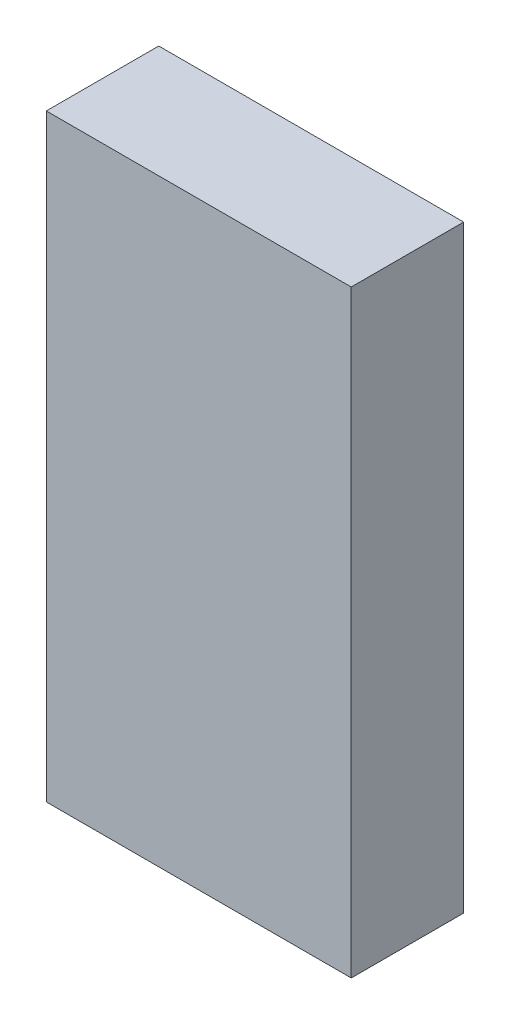
ISO-10303-21;
HEADER;
FILE_DESCRIPTION(('STEP AP214'),'2;1');
FILE_NAME('part.step','',(''),(''),'','','');
FILE_SCHEMA(('AUTOMOTIVE_DESIGN { 1 0 10303 214 1 1 1 1 }'));
ENDSEC;
DATA;
#1=APPLICATION_CONTEXT('core data for automotive mechanical design processes');
#2=APPLICATION_PROTOCOL_DEFINITION('international standard','automotive_design',2000,#1);
#3=PRODUCT_CONTEXT('',#1,'mechanical');
#4=PRODUCT('Part','Part','',(#3));
#5=PRODUCT_RELATED_PRODUCT_CATEGORY('part','',(#4));
#6=PRODUCT_DEFINITION_FORMATION('','',#4);
#7=PRODUCT_DEFINITION_CONTEXT('part definition',#1,'design');
#8=PRODUCT_DEFINITION('design','',#6,#7);
#9=PRODUCT_DEFINITION_SHAPE('','',#8);
#10=(LENGTH_UNIT() NAMED_UNIT(*) SI_UNIT(.MILLI.,.METRE.));
#11=(NAMED_UNIT(*) PLANE_ANGLE_UNIT() SI_UNIT($,.RADIAN.));
#12=(NAMED_UNIT(*) SI_UNIT($,.STERADIAN.) SOLID_ANGLE_UNIT());
#13=UNCERTAINTY_MEASURE_WITH_UNIT(LENGTH_MEASURE(1.E-05),#10,'distance_accuracy_value','');
#14=(GEOMETRIC_REPRESENTATION_CONTEXT(3) GLOBAL_UNCERTAINTY_ASSIGNED_CONTEXT((#13)) GLOBAL_UNIT_ASSIGNED_CONTEXT((#10,
#11,#12)) REPRESENTATION_CONTEXT('',''));
#15=CARTESIAN_POINT('',(0.,0.,0.));
#16=DIRECTION('',(0.,0.,1.));
#17=DIRECTION('',(1.,0.,0.));
#18=AXIS2_PLACEMENT_3D('',#15,#16,#17);
#19=CARTESIAN_POINT('',(-0.8,0.,0.325000000006));
#20=DIRECTION('',(-1.,0.,0.));
#21=DIRECTION('',(0.,0.,1.));
#22=AXIS2_PLACEMENT_3D('',#19,#20,#21);
#23=PLANE('',#22);
#24=DIRECTION('',(0.,-1.,0.));
#25=VECTOR('',#24,1.);
#26=CARTESIAN_POINT('',(-0.8,-1.570000000033,0.02999999998487));
#27=LINE('',#26,#25);
#28=CARTESIAN_POINT('',(-0.8,1.570000000033,0.02999999998487));
#29=VERTEX_POINT('',#28);
#30=CARTESIAN_POINT('',(-0.8,-1.570000000033,0.02999999998487));
#31=VERTEX_POINT('',#30);
#32=EDGE_CURVE('E11',#29,#31,#27,.T.);
#33=ORIENTED_EDGE('',*,*,#32,.T.);
#34=DIRECTION('',(0.,0.,1.));
#35=VECTOR('',#34,1.);
#36=CARTESIAN_POINT('',(-0.8,-1.570000000033,0.620000000027));
#37=LINE('',#36,#35);
#38=CARTESIAN_POINT('',(-0.8,-1.570000000033,0.620000000027));
#39=VERTEX_POINT('',#38);
#40=EDGE_CURVE('E104',#31,#39,#37,.T.);
#41=ORIENTED_EDGE('',*,*,#40,.T.);
#42=DIRECTION('',(0.,1.,0.));
#43=VECTOR('',#42,1.);
#44=CARTESIAN_POINT('',(-0.8,1.570000000033,0.620000000027));
#45=LINE('',#44,#43);
#46=CARTESIAN_POINT('',(-0.8,1.570000000033,0.620000000027));
#47=VERTEX_POINT('',#46);
#48=EDGE_CURVE('E62',#39,#47,#45,.T.);
#49=ORIENTED_EDGE('',*,*,#48,.T.);
#50=DIRECTION('',(0.,0.,-1.));
#51=VECTOR('',#50,1.);
#52=CARTESIAN_POINT('',(-0.8,1.570000000033,0.02999999998487));
#53=LINE('',#52,#51);
#54=EDGE_CURVE('E76',#47,#29,#53,.T.);
#55=ORIENTED_EDGE('',*,*,#54,.T.);
#56=EDGE_LOOP('',(#33,#41,#49,#55));
#57=FACE_BOUND('',#56,.T.);
#58=ADVANCED_FACE('F16',(#57),#23,.T.);
#59=CARTESIAN_POINT('',(0.8,0.,0.325000000006));
#60=DIRECTION('',(1.,0.,0.));
#61=DIRECTION('',(0.,1.,0.));
#62=AXIS2_PLACEMENT_3D('',#59,#60,#61);
#63=PLANE('',#62);
#64=DIRECTION('',(0.,1.,0.));
#65=VECTOR('',#64,1.);
#66=CARTESIAN_POINT('',(0.8,-1.570000000033,0.02999999998487));
#67=LINE('',#66,#65);
#68=CARTESIAN_POINT('',(0.8,-1.570000000033,0.02999999998487));
#69=VERTEX_POINT('',#68);
#70=CARTESIAN_POINT('',(0.8,1.570000000033,0.02999999998487));
#71=VERTEX_POINT('',#70);
#72=EDGE_CURVE('E20',#69,#71,#67,.T.);
#73=ORIENTED_EDGE('',*,*,#72,.T.);
#74=DIRECTION('',(0.,0.,1.));
#75=VECTOR('',#74,1.);
#76=CARTESIAN_POINT('',(0.8,1.570000000033,0.02999999998487));
#77=LINE('',#76,#75);
#78=CARTESIAN_POINT('',(0.8,1.570000000033,0.620000000027));
#79=VERTEX_POINT('',#78);
#80=EDGE_CURVE('E84',#71,#79,#77,.T.);
#81=ORIENTED_EDGE('',*,*,#80,.T.);
#82=DIRECTION('',(0.,-1.,0.));
#83=VECTOR('',#82,1.);
#84=CARTESIAN_POINT('',(0.8,1.570000000033,0.620000000027));
#85=LINE('',#84,#83);
#86=CARTESIAN_POINT('',(0.8,-1.570000000033,0.620000000027));
#87=VERTEX_POINT('',#86);
#88=EDGE_CURVE('E95',#79,#87,#85,.T.);
#89=ORIENTED_EDGE('',*,*,#88,.T.);
#90=DIRECTION('',(0.,0.,-1.));
#91=VECTOR('',#90,1.);
#92=CARTESIAN_POINT('',(0.8,-1.570000000033,0.620000000027));
#93=LINE('',#92,#91);
#94=EDGE_CURVE('E102',#87,#69,#93,.T.);
#95=ORIENTED_EDGE('',*,*,#94,.T.);
#96=EDGE_LOOP('',(#73,#81,#89,#95));
#97=FACE_BOUND('',#96,.T.);
#98=ADVANCED_FACE('F18',(#97),#63,.T.);
#99=CARTESIAN_POINT('',(0.8,1.570000000033,0.02999999998487));
#100=DIRECTION('',(0.,0.,-1.));
#101=DIRECTION('',(0.,-1.,0.));
#102=AXIS2_PLACEMENT_3D('',#99,#100,#101);
#103=PLANE('',#102);
#104=ORIENTED_EDGE('',*,*,#72,.F.);
#105=DIRECTION('',(-1.,0.,0.));
#106=VECTOR('',#105,1.);
#107=CARTESIAN_POINT('',(0.8,-1.570000000033,0.02999999998487));
#108=LINE('',#107,#106);
#109=EDGE_CURVE('E73',#69,#31,#108,.T.);
#110=ORIENTED_EDGE('',*,*,#109,.T.);
#111=ORIENTED_EDGE('',*,*,#32,.F.);
#112=DIRECTION('',(-1.,0.,0.));
#113=VECTOR('',#112,1.);
#114=CARTESIAN_POINT('',(0.8,1.570000000033,0.02999999998487));
#115=LINE('',#114,#113);
#116=EDGE_CURVE('E70',#71,#29,#115,.T.);
#117=ORIENTED_EDGE('',*,*,#116,.F.);
#118=EDGE_LOOP('',(#104,#110,#111,#117));
#119=FACE_BOUND('',#118,.T.);
#120=ADVANCED_FACE('F68',(#119),#103,.T.);
#121=CARTESIAN_POINT('',(0.8,-1.570000000033,0.02999999998487));
#122=DIRECTION('',(0.,-1.,0.));
#123=DIRECTION('',(0.,0.,-1.));
#124=AXIS2_PLACEMENT_3D('',#121,#122,#123);
#125=PLANE('',#124);
#126=ORIENTED_EDGE('',*,*,#94,.F.);
#127=DIRECTION('',(-1.,0.,0.));
#128=VECTOR('',#127,1.);
#129=CARTESIAN_POINT('',(0.8,-1.570000000033,0.620000000027));
#130=LINE('',#129,#128);
#131=EDGE_CURVE('E94',#87,#39,#130,.T.);
#132=ORIENTED_EDGE('',*,*,#131,.T.);
#133=ORIENTED_EDGE('',*,*,#40,.F.);
#134=ORIENTED_EDGE('',*,*,#109,.F.);
#135=EDGE_LOOP('',(#126,#132,#133,#134));
#136=FACE_BOUND('',#135,.T.);
#137=ADVANCED_FACE('F166',(#136),#125,.T.);
#138=CARTESIAN_POINT('',(0.8,-1.570000000033,0.620000000027));
#139=DIRECTION('',(0.,0.,1.));
#140=DIRECTION('',(1.,0.,0.));
#141=AXIS2_PLACEMENT_3D('',#138,#139,#140);
#142=PLANE('',#141);
#143=ORIENTED_EDGE('',*,*,#88,.F.);
#144=DIRECTION('',(-1.,0.,0.));
#145=VECTOR('',#144,1.);
#146=CARTESIAN_POINT('',(0.8,1.570000000033,0.620000000027));
#147=LINE('',#146,#145);
#148=EDGE_CURVE('E80',#79,#47,#147,.T.);
#149=ORIENTED_EDGE('',*,*,#148,.T.);
#150=ORIENTED_EDGE('',*,*,#48,.F.);
#151=ORIENTED_EDGE('',*,*,#131,.F.);
#152=EDGE_LOOP('',(#143,#149,#150,#151));
#153=FACE_BOUND('',#152,.T.);
#154=ADVANCED_FACE('F115',(#153),#142,.T.);
#155=CARTESIAN_POINT('',(0.8,1.570000000033,0.620000000027));
#156=DIRECTION('',(0.,1.,0.));
#157=DIRECTION('',(1.,0.,0.));
#158=AXIS2_PLACEMENT_3D('',#155,#156,#157);
#159=PLANE('',#158);
#160=ORIENTED_EDGE('',*,*,#80,.F.);
#161=ORIENTED_EDGE('',*,*,#116,.T.);
#162=ORIENTED_EDGE('',*,*,#54,.F.);
#163=ORIENTED_EDGE('',*,*,#148,.F.);
#164=EDGE_LOOP('',(#160,#161,#162,#163));
#165=FACE_BOUND('',#164,.T.);
#166=ADVANCED_FACE('F82',(#165),#159,.T.);
#167=CLOSED_SHELL('',(#58,#98,#120,#137,#154,#166));
#168=MANIFOLD_SOLID_BREP('B1',#167);
#169=ADVANCED_BREP_SHAPE_REPRESENTATION('',(#18,#168),#14);
#170=SHAPE_DEFINITION_REPRESENTATION(#9,#169);
ENDSEC;
END-ISO-10303-21;
